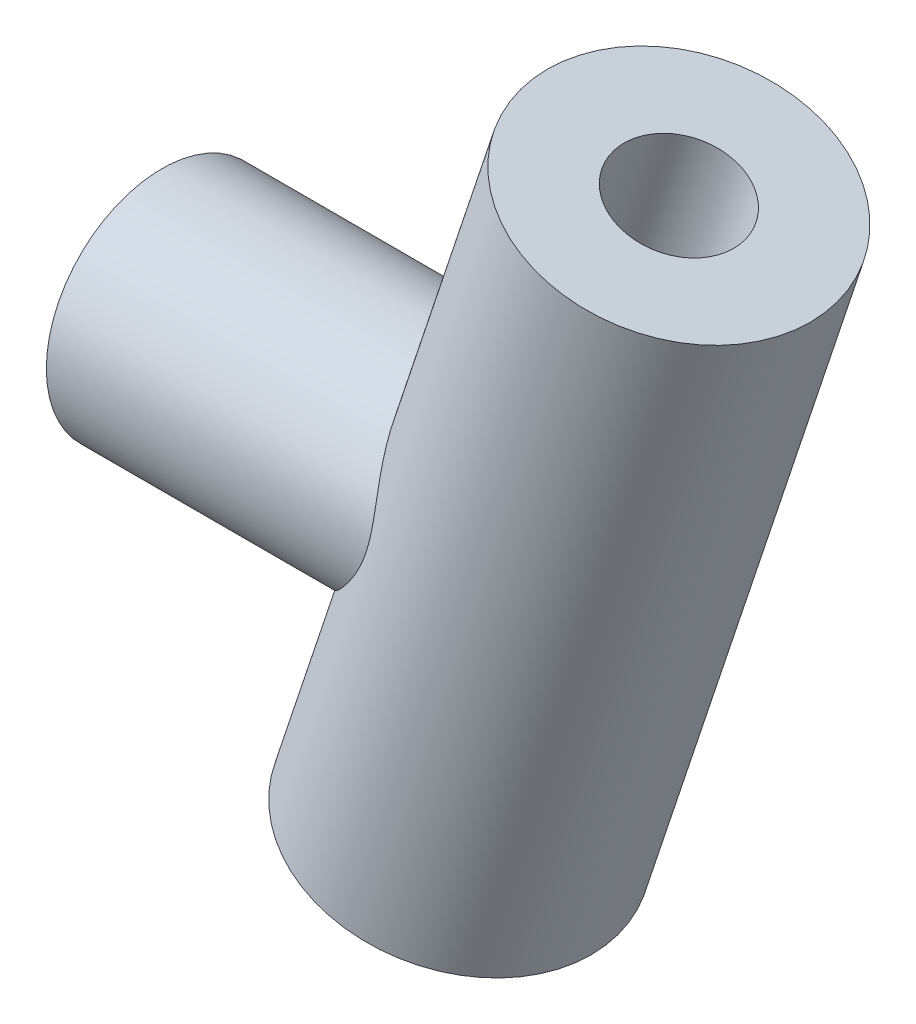
ISO-10303-21;
HEADER;
FILE_DESCRIPTION(('STEP AP214'),'2;1');
FILE_NAME('part.step','',(''),(''),'','','');
FILE_SCHEMA(('AUTOMOTIVE_DESIGN { 1 0 10303 214 1 1 1 1 }'));
ENDSEC;
DATA;
#1=APPLICATION_CONTEXT('core data for automotive mechanical design processes');
#2=APPLICATION_PROTOCOL_DEFINITION('international standard','automotive_design',2000,#1);
#3=PRODUCT_CONTEXT('',#1,'mechanical');
#4=PRODUCT('Part','Part','',(#3));
#5=PRODUCT_RELATED_PRODUCT_CATEGORY('part','',(#4));
#6=PRODUCT_DEFINITION_FORMATION('','',#4);
#7=PRODUCT_DEFINITION_CONTEXT('part definition',#1,'design');
#8=PRODUCT_DEFINITION('design','',#6,#7);
#9=PRODUCT_DEFINITION_SHAPE('','',#8);
#10=(LENGTH_UNIT() NAMED_UNIT(*) SI_UNIT(.MILLI.,.METRE.));
#11=(NAMED_UNIT(*) PLANE_ANGLE_UNIT() SI_UNIT($,.RADIAN.));
#12=(NAMED_UNIT(*) SI_UNIT($,.STERADIAN.) SOLID_ANGLE_UNIT());
#13=UNCERTAINTY_MEASURE_WITH_UNIT(LENGTH_MEASURE(1.E-05),#10,'distance_accuracy_value','');
#14=(GEOMETRIC_REPRESENTATION_CONTEXT(3) GLOBAL_UNCERTAINTY_ASSIGNED_CONTEXT((#13)) GLOBAL_UNIT_ASSIGNED_CONTEXT((#10,
#11,#12)) REPRESENTATION_CONTEXT('',''));
#15=CARTESIAN_POINT('',(0.,0.,0.));
#16=DIRECTION('',(0.,0.,1.));
#17=DIRECTION('',(1.,0.,0.));
#18=AXIS2_PLACEMENT_3D('',#15,#16,#17);
#19=CARTESIAN_POINT('',(108.368366818809,40.1471764116337,220.40323439009));
#20=DIRECTION('',(-0.316227766016478,-0.948683298050634,0.));
#21=DIRECTION('',(0.948683298050634,-0.316227766016478,0.));
#22=AXIS2_PLACEMENT_3D('',#19,#20,#21);
#23=CYLINDRICAL_SURFACE('',#22,2.50000000000002);
#24=CARTESIAN_POINT('',(102.043811498479,21.173510450621,220.40323439009));
#25=DIRECTION('',(-0.316227766016478,-0.948683298050634,0.));
#26=DIRECTION('',(0.948683298050634,-0.316227766016478,0.));
#27=AXIS2_PLACEMENT_3D('',#24,#25,#26);
#28=CIRCLE('',#27,2.50000000000002);
#29=CARTESIAN_POINT('',(104.415519743606,20.3829410355798,220.40323439009));
#30=VERTEX_POINT('',#29);
#31=EDGE_CURVE('E188',#30,#30,#28,.T.);
#32=ORIENTED_EDGE('',*,*,#31,.F.);
#33=EDGE_LOOP('',(#32));
#34=FACE_BOUND('',#33,.T.);
#35=CARTESIAN_POINT('',(92.5569785179846,-7.286988490898,220.40323439009));
#36=DIRECTION('',(-0.316227766016478,-0.948683298050634,0.));
#37=DIRECTION('',(0.948683298050634,-0.316227766016478,0.));
#38=AXIS2_PLACEMENT_3D('',#35,#36,#37);
#39=CIRCLE('',#38,2.50000000000002);
#40=CARTESIAN_POINT('',(94.9286867631113,-8.0775579059392,220.40323439009));
#41=VERTEX_POINT('',#40);
#42=EDGE_CURVE('E70',#41,#41,#39,.T.);
#43=ORIENTED_EDGE('',*,*,#42,.T.);
#44=EDGE_LOOP('',(#43));
#45=FACE_BOUND('',#44,.T.);
#46=CARTESIAN_POINT('',(96.6617424772157,5.02730338681082,220.40323439009));
#47=DIRECTION('',(-1.,0.,0.));
#48=DIRECTION('',(0.,-1.,0.));
#49=AXIS2_PLACEMENT_3D('',#46,#47,#48);
#50=ELLIPSE('',#49,7.90569415042994,2.50000000000002);
#51=CARTESIAN_POINT('',(96.6617424772157,5.76218705966372,217.914058904364));
#52=VERTEX_POINT('',#51);
#53=CARTESIAN_POINT('',(96.6617424772157,6.4419181472921,217.94358268549));
#54=VERTEX_POINT('',#53);
#55=EDGE_CURVE('E11',#52,#54,#50,.F.);
#56=ORIENTED_EDGE('',*,*,#55,.F.);
#57=CARTESIAN_POINT('',(96.9841672422155,5.99457768181144,220.40323439009));
#58=DIRECTION('',(0.58471028466392,-0.811242185175449,0.));
#59=DIRECTION('',(-0.811242185175449,-0.58471028466392,0.));
#60=AXIS2_PLACEMENT_3D('',#57,#58,#59);
#61=ELLIPSE('',#60,4.27562173194365,2.50000000000001);
#62=CARTESIAN_POINT('',(96.6617424772158,5.76218705966011,222.892409875816));
#63=VERTEX_POINT('',#62);
#64=EDGE_CURVE('E69',#52,#63,#61,.F.);
#65=ORIENTED_EDGE('',*,*,#64,.T.);
#66=CARTESIAN_POINT('',(96.6617424772158,6.44191814729567,222.86288609469));
#67=VERTEX_POINT('',#66);
#68=EDGE_CURVE('E44',#67,#63,#50,.F.);
#69=ORIENTED_EDGE('',*,*,#68,.F.);
#70=CARTESIAN_POINT('',(96.9841672422155,5.99457768181144,220.40323439009));
#71=DIRECTION('',(-0.811242185175449,-0.58471028466392,0.));
#72=DIRECTION('',(0.58471028466392,-0.811242185175449,0.));
#73=AXIS2_PLACEMENT_3D('',#70,#71,#72);
#74=ELLIPSE('',#73,3.08169378477195,2.50000000000001);
#75=EDGE_CURVE('E38',#67,#54,#74,.T.);
#76=ORIENTED_EDGE('',*,*,#75,.T.);
#77=EDGE_LOOP('',(#56,#65,#69,#76));
#78=FACE_BOUND('',#77,.T.);
#79=ADVANCED_FACE('F33',(#34,#45,#78),#23,.F.);
#80=CARTESIAN_POINT('',(102.043811498479,21.173510450621,220.40323439009));
#81=DIRECTION('',(-0.316227766016478,-0.948683298050634,0.));
#82=DIRECTION('',(0.948683298050634,-0.316227766016478,0.));
#83=AXIS2_PLACEMENT_3D('',#80,#81,#82);
#84=CYLINDRICAL_SURFACE('',#83,6.00000000000001);
#85=CARTESIAN_POINT('',(93.4881377483158,5.99457768181147,225.40323439009));
#86=CARTESIAN_POINT('',(93.5399946342217,6.15021178801324,225.403226217205));
#87=CARTESIAN_POINT('',(93.5813798218866,6.3094517385014,225.39592273332));
#88=CARTESIAN_POINT('',(93.6404073699744,6.63073387960701,225.3652204));
#89=CARTESIAN_POINT('',(93.6580566877448,6.79277523497842,225.341826270021));
#90=CARTESIAN_POINT('',(93.6710984489186,7.11372633043472,225.279110588274));
#91=CARTESIAN_POINT('',(93.6665915890211,7.27264694919356,225.239861839614));
#92=CARTESIAN_POINT('',(93.6401028962219,7.58465563049313,225.14646767995));
#93=CARTESIAN_POINT('',(93.6180907491946,7.73773309201226,225.092296534103));
#94=CARTESIAN_POINT('',(93.5672063366524,8.00695138314288,224.982233603437));
#95=CARTESIAN_POINT('',(93.5404890230361,8.12450304439958,224.928707971729));
#96=CARTESIAN_POINT('',(93.4813860333426,8.35404939998473,224.813381315847));
#97=CARTESIAN_POINT('',(93.4489972701267,8.46604102498614,224.751575789007));
#98=CARTESIAN_POINT('',(93.3804700552284,8.68430788984032,224.620059725234));
#99=CARTESIAN_POINT('',(93.3443256984145,8.79057371586189,224.550336722721));
#100=CARTESIAN_POINT('',(93.2699291741275,8.99699444050149,224.403426644381));
#101=CARTESIAN_POINT('',(93.2316773294419,9.09715027001568,224.326240710233));
#102=CARTESIAN_POINT('',(93.1529600855957,9.29467544418092,224.161753524947));
#103=CARTESIAN_POINT('',(93.1124647292586,9.39181182984803,224.074186868872));
#104=CARTESIAN_POINT('',(93.0317973832353,9.57903996151219,223.891605552065));
#105=CARTESIAN_POINT('',(92.9916255273493,9.66912891468684,223.796587968181));
#106=CARTESIAN_POINT('',(92.9126767912046,9.84178597782958,223.5995039877));
#107=CARTESIAN_POINT('',(92.8738991336388,9.92435831914359,223.497441614461));
#108=CARTESIAN_POINT('',(92.7986236985677,10.0815743599006,223.286592010638));
#109=CARTESIAN_POINT('',(92.7621258480848,10.1562183131875,223.177804995535));
#110=CARTESIAN_POINT('',(92.6883707801357,10.3048183462116,222.941613806855));
#111=CARTESIAN_POINT('',(92.6514718207106,10.3777951810879,222.813478188994));
#112=CARTESIAN_POINT('',(92.5824749065347,10.5125852837347,222.550203741524));
#113=CARTESIAN_POINT('',(92.5503773790522,10.5743975580986,222.415064290101));
#114=CARTESIAN_POINT('',(92.4918731024728,10.68605924564,222.138799538068));
#115=CARTESIAN_POINT('',(92.4654639350428,10.7359137435401,221.997676811833));
#116=CARTESIAN_POINT('',(92.4190628571841,10.8229715450181,221.710561974183));
#117=CARTESIAN_POINT('',(92.399069912189,10.8601768882321,221.564570651986));
#118=CARTESIAN_POINT('',(92.3679164923902,10.9179337604634,221.285580312055));
#119=CARTESIAN_POINT('',(92.3560190212329,10.939881044545,221.152950939072));
#120=CARTESIAN_POINT('',(92.3380150422669,10.9730368488028,220.885969566114));
#121=CARTESIAN_POINT('',(92.3319080549783,10.9842462581279,220.751617709701));
#122=CARTESIAN_POINT('',(92.3256315015416,10.995766359125,220.48236871927));
#123=CARTESIAN_POINT('',(92.3254593457347,10.9960818043695,220.347471848767));
#124=CARTESIAN_POINT('',(92.3310501350273,10.9858213564836,220.078219488395));
#125=CARTESIAN_POINT('',(92.3368128527068,10.9752458806854,219.94386397798));
#126=CARTESIAN_POINT('',(92.3534481822985,10.9446191554965,219.687395051075));
#127=CARTESIAN_POINT('',(92.3638802728977,10.9253841129757,219.565154329911));
#128=CARTESIAN_POINT('',(92.3894539011641,10.8780249558964,219.322871276463));
#129=CARTESIAN_POINT('',(92.4045969105257,10.8498980634731,219.202829643602));
#130=CARTESIAN_POINT('',(92.4392928494744,10.7850717565278,218.965787078353));
#131=CARTESIAN_POINT('',(92.4588440732261,10.7483756578138,218.848784989241));
#132=CARTESIAN_POINT('',(92.5019857731557,10.666774572769,218.618429265966));
#133=CARTESIAN_POINT('',(92.52557772659,10.621866583833,218.50507698421));
#134=CARTESIAN_POINT('',(92.6035823959805,10.4719625766131,218.163551891986));
#135=CARTESIAN_POINT('',(92.663970554337,10.3540735066996,217.942248415681));
#136=CARTESIAN_POINT('',(92.7957048090172,10.0884657465613,217.521908037273));
#137=CARTESIAN_POINT('',(92.8670587365027,9.94072571446628,217.322887225218));
#138=CARTESIAN_POINT('',(92.98222079609,9.69006441121618,217.032438168669));
#139=CARTESIAN_POINT('',(93.024265282101,9.59619367307118,216.932333393518));
#140=CARTESIAN_POINT('',(93.1087764859234,9.40065990232594,216.74026085894));
#141=CARTESIAN_POINT('',(93.1512430949016,9.29899883511581,216.648291059704));
#142=CARTESIAN_POINT('',(93.2352432818767,9.08818718285487,216.47278874183));
#143=CARTESIAN_POINT('',(93.276776430556,8.97903324160091,216.389260046085));
#144=CARTESIAN_POINT('',(93.3571747091223,8.75359965007913,216.231094522344));
#145=CARTESIAN_POINT('',(93.3960406522102,8.63732219233914,216.156454978996));
#146=CARTESIAN_POINT('',(93.4859258075341,8.34256364251297,215.984177988043));
#147=CARTESIAN_POINT('',(93.5342886664053,8.16011652086038,215.891799392993));
#148=CARTESIAN_POINT('',(93.6122303196025,7.78198749521245,215.729126513749));
#149=CARTESIAN_POINT('',(93.641854289393,7.58633868883306,215.658779325057));
#150=CARTESIAN_POINT('',(93.6686260074032,7.22623956542186,215.55445801533));
#151=CARTESIAN_POINT('',(93.6711518025921,7.06353297304686,215.515996755412));
#152=CARTESIAN_POINT('',(93.652871426068,6.73642296341325,215.455788424371));
#153=CARTESIAN_POINT('',(93.6320992575564,6.57202236512267,215.434017072438));
#154=CARTESIAN_POINT('',(93.5662660812505,6.24687264978509,215.406934556564));
#155=CARTESIAN_POINT('',(93.5212097724162,6.08612283258424,215.401620209549));
#156=CARTESIAN_POINT('',(93.4100881583332,5.77218066942791,215.405704701502));
#157=CARTESIAN_POINT('',(93.3439884400603,5.61900118087267,215.415127740492));
#158=CARTESIAN_POINT('',(93.2111134187566,5.35206292568951,215.443256238535));
#159=CARTESIAN_POINT('',(93.1471779980172,5.23659666774436,215.459699149371));
#160=CARTESIAN_POINT('',(93.0118087648243,5.01134089480788,215.499528363738));
#161=CARTESIAN_POINT('',(92.9403699263902,4.90155525926729,215.522919340681));
#162=CARTESIAN_POINT('',(92.791833396205,4.68690457540017,215.575992528545));
#163=CARTESIAN_POINT('',(92.714715869707,4.58205909662266,215.605697547759));
#164=CARTESIAN_POINT('',(92.5566494188812,4.37712945112315,215.670855120958));
#165=CARTESIAN_POINT('',(92.475699107779,4.27704703443888,215.706309766694));
#166=CARTESIAN_POINT('',(92.2508661485316,4.00919107118135,215.810679804681));
#167=CARTESIAN_POINT('',(92.1044201395336,3.84567563398287,215.885048492147));
#168=CARTESIAN_POINT('',(91.8086191566184,3.52941769570027,216.049530325673));
#169=CARTESIAN_POINT('',(91.6592620277588,3.37668359439715,216.139655561749));
#170=CARTESIAN_POINT('',(91.3614026656051,3.08131293453164,216.33576994551));
#171=CARTESIAN_POINT('',(91.2128996038588,2.93866412926377,216.441739348586));
#172=CARTESIAN_POINT('',(90.9197455883938,2.66327259306965,216.670352390667));
#173=CARTESIAN_POINT('',(90.7750919100518,2.53052272880897,216.792983839329));
#174=CARTESIAN_POINT('',(90.5439600153414,2.32187401159439,217.008407117334));
#175=CARTESIAN_POINT('',(90.4553986670382,2.24280836205613,217.095904969133));
#176=CARTESIAN_POINT('',(90.2820742396273,2.08942895341036,217.27848747381));
#177=CARTESIAN_POINT('',(90.1973117453026,2.01511592515916,217.373573288533));
#178=CARTESIAN_POINT('',(89.9505809540233,1.80037056762376,217.670434194612));
#179=CARTESIAN_POINT('',(89.7956887855756,1.66770244111382,217.884246806933));
#180=CARTESIAN_POINT('',(89.5508602775412,1.45990704081427,218.287878846334));
#181=CARTESIAN_POINT('',(89.454336032854,1.37866553902394,218.470535393593));
#182=CARTESIAN_POINT('',(89.284449460387,1.2363559403988,218.853748099768));
#183=CARTESIAN_POINT('',(89.2110568105426,1.17526142896231,219.054280379922));
#184=CARTESIAN_POINT('',(89.103258760979,1.08576255731848,219.43601753969));
#185=CARTESIAN_POINT('',(89.0644679626028,1.05366950406647,219.615103917172));
#186=CARTESIAN_POINT('',(89.0106998637483,1.00922311325651,219.97921470761));
#187=CARTESIAN_POINT('',(88.9957064581816,0.996856425684145,220.164235018142));
#188=CARTESIAN_POINT('',(88.9908791223638,0.992872553010082,220.535126049214));
#189=CARTESIAN_POINT('',(89.0010849670597,1.00128817107432,220.720997651365));
#190=CARTESIAN_POINT('',(89.0457882899918,1.03822180920517,221.0877469386));
#191=CARTESIAN_POINT('',(89.0802976475827,1.06674965997077,221.268622136534));
#192=CARTESIAN_POINT('',(89.1702865400973,1.14138525782732,221.619106227049));
#193=CARTESIAN_POINT('',(89.2255504099667,1.18731224793816,221.788810579739));
#194=CARTESIAN_POINT('',(89.3534343537352,1.29407628680287,222.116427305357));
#195=CARTESIAN_POINT('',(89.4260603433698,1.35491841772169,222.274335634947));
#196=CARTESIAN_POINT('',(89.6338856642143,1.53005839796968,222.670278051627));
#197=CARTESIAN_POINT('',(89.7801699157457,1.65427643593801,222.898169663439));
#198=CARTESIAN_POINT('',(90.0169852564744,1.85826498849377,223.215141197954));
#199=CARTESIAN_POINT('',(90.0990025478227,1.9293639817217,223.316831513276));
#200=CARTESIAN_POINT('',(90.2676857449354,2.07680575439823,223.512256338652));
#201=CARTESIAN_POINT('',(90.3543505949713,2.15314734404722,223.605992643133));
#202=CARTESIAN_POINT('',(90.5747307566984,2.34919618648921,223.83004082568));
#203=CARTESIAN_POINT('',(90.7106346962231,2.47177494612788,223.955684268026));
#204=CARTESIAN_POINT('',(90.9873976449966,2.72628865743146,224.191157303565));
#205=CARTESIAN_POINT('',(91.1282597563333,2.85822952089509,224.300976769502));
#206=CARTESIAN_POINT('',(91.4122707216118,3.1312011203936,224.505698463503));
#207=CARTESIAN_POINT('',(91.5554215126224,3.27223990039978,224.600587228391));
#208=CARTESIAN_POINT('',(91.8410075533882,3.56363500458543,224.775811568719));
#209=CARTESIAN_POINT('',(91.983443153298,3.71398616297768,224.856155117383));
#210=CARTESIAN_POINT('',(92.21193160541,3.96731828454587,224.9750877151));
#211=CARTESIAN_POINT('',(92.2992443220291,4.06710994139565,225.018089828091));
#212=CARTESIAN_POINT('',(92.471110037339,4.2713234652904,225.098171065435));
#213=CARTESIAN_POINT('',(92.5556637277974,4.37574415597361,225.135251683699));
#214=CARTESIAN_POINT('',(92.7203638972282,4.58949200587991,225.203053896272));
#215=CARTESIAN_POINT('',(92.800522889388,4.69880343133411,225.23379431661));
#216=CARTESIAN_POINT('',(92.9548084266244,4.92318305608808,225.288461180011));
#217=CARTESIAN_POINT('',(93.0289385565819,5.0382477676546,225.312391693852));
#218=CARTESIAN_POINT('',(93.1769273489551,5.28841803948344,225.354924898646));
#219=CARTESIAN_POINT('',(93.2497646493043,5.42430291450392,225.372592304952));
#220=CARTESIAN_POINT('',(93.3808852064124,5.70391671980737,225.396747031225));
#221=CARTESIAN_POINT('',(93.4391785345892,5.84764013753828,225.403242106289));
#222=CARTESIAN_POINT('',(93.4881377483158,5.99457768181147,225.40323439009));
#223=B_SPLINE_CURVE_WITH_KNOTS('',3,(#85,#86,#87,#88,#89,#90,#91,#92,#93,#94,#95,#96,#97,#98,
#99,#100,#101,#102,#103,#104,#105,#106,#107,#108,#109,#110,#111,#112,#113,#114,#115,#116,#117,
#118,#119,#120,#121,#122,#123,#124,#125,#126,#127,#128,#129,#130,#131,#132,#133,#134,#135,#136,
#137,#138,#139,#140,#141,#142,#143,#144,#145,#146,#147,#148,#149,#150,#151,#152,#153,#154,#155,
#156,#157,#158,#159,#160,#161,#162,#163,#164,#165,#166,#167,#168,#169,#170,#171,#172,#173,#174,
#175,#176,#177,#178,#179,#180,#181,#182,#183,#184,#185,#186,#187,#188,#189,#190,#191,#192,#193,
#194,#195,#196,#197,#198,#199,#200,#201,#202,#203,#204,#205,#206,#207,#208,#209,#210,#211,#212,
#213,#214,#215,#216,#217,#218,#219,#220,#221,#222),.UNSPECIFIED.,.T.,.F.,(4,2,2,2,2,2,2,2,2,2,2,
2,2,2,2,2,2,2,2,2,2,2,2,2,2,2,2,2,2,2,2,2,2,2,2,2,2,2,2,2,2,2,2,2,2,2,2,2,2,2,2,2,2,2,2,2,2,2,2,
2,2,2,2,2,2,2,2,2,4),(0.,0.49165109712229,0.98315805233687,1.47243324855553,1.96255757863624,
2.3577366079243,2.75313141740821,3.14915761639836,3.5451233268527,3.9554561054292,
4.36595067931223,4.77621272463075,5.18646163059141,5.64184719315233,6.09727325532755,
6.55250531512938,7.00766393535201,7.41199601296455,7.81629460699937,8.22041678344346,
8.62452347479793,8.99664704355804,9.36888698092494,9.74098312003127,10.1132155858442,
10.8835918499678,11.6545208540642,12.0847231294231,12.5148172258931,12.9451052429735,
13.3752614818361,14.00370487561,14.6306273936651,15.1300960679132,15.6288367189186,
16.1274808986726,16.6269447540704,17.0254023911575,17.4241286482942,17.8243204797313,
18.2246582315264,18.9189620670602,19.6138009996933,20.3077811490131,21.0012562729919,
21.4433901003237,21.885591756149,22.7676820999813,23.4314137634769,24.0942717200226,
24.6499390319937,25.205230130786,25.7613982711105,26.3178384506362,26.8686496998366,
27.4196488932257,28.3080339472381,28.7540052871491,29.199875746881,29.8649014882159,
30.5303509697176,31.196397097561,31.8620770073524,32.280074203306,32.6979657771534,
33.1145980451139,33.5309807358619,33.9954817850233,34.4596602778577),.UNSPECIFIED.);
#224=CARTESIAN_POINT('',(93.4881377483158,5.99457768181147,225.40323439009));
#225=VERTEX_POINT('',#224);
#226=EDGE_CURVE('E76',#225,#225,#223,.T.);
#227=ORIENTED_EDGE('',*,*,#226,.F.);
#228=EDGE_LOOP('',(#227));
#229=FACE_BOUND('',#228,.T.);
#230=CARTESIAN_POINT('',(102.043811498479,21.173510450621,220.40323439009));
#231=DIRECTION('',(-0.316227766016478,-0.948683298050634,0.));
#232=DIRECTION('',(0.948683298050634,-0.316227766016478,0.));
#233=AXIS2_PLACEMENT_3D('',#230,#231,#232);
#234=CIRCLE('',#233,6.00000000000001);
#235=CARTESIAN_POINT('',(107.735911286783,19.2761438545221,220.40323439009));
#236=VERTEX_POINT('',#235);
#237=EDGE_CURVE('E83',#236,#236,#234,.T.);
#238=ORIENTED_EDGE('',*,*,#237,.T.);
#239=EDGE_LOOP('',(#238));
#240=FACE_BOUND('',#239,.T.);
#241=CARTESIAN_POINT('',(92.5569785179846,-7.28698849089801,220.40323439009));
#242=DIRECTION('',(-0.316227766016478,-0.948683298050634,0.));
#243=DIRECTION('',(0.948683298050634,-0.316227766016478,0.));
#244=AXIS2_PLACEMENT_3D('',#241,#242,#243);
#245=CIRCLE('',#244,6.00000000000006);
#246=CARTESIAN_POINT('',(98.2490783062885,-9.18435508699689,220.40323439009));
#247=VERTEX_POINT('',#246);
#248=EDGE_CURVE('E186',#247,#247,#245,.T.);
#249=ORIENTED_EDGE('',*,*,#248,.F.);
#250=EDGE_LOOP('',(#249));
#251=FACE_BOUND('',#250,.T.);
#252=ADVANCED_FACE('F35',(#229,#240,#251),#84,.T.);
#253=CARTESIAN_POINT('',(102.043811498479,21.173510450621,220.40323439009));
#254=DIRECTION('',(-0.316227766016478,-0.948683298050634,0.));
#255=DIRECTION('',(0.948683298050634,-0.316227766016478,0.));
#256=AXIS2_PLACEMENT_3D('',#253,#254,#255);
#257=PLANE('',#256);
#258=ORIENTED_EDGE('',*,*,#31,.T.);
#259=EDGE_LOOP('',(#258));
#260=FACE_BOUND('',#259,.T.);
#261=ORIENTED_EDGE('',*,*,#237,.F.);
#262=EDGE_LOOP('',(#261));
#263=FACE_BOUND('',#262,.T.);
#264=ADVANCED_FACE('F95',(#260,#263),#257,.F.);
#265=CARTESIAN_POINT('',(92.5569785179846,-7.28698849089801,220.40323439009));
#266=DIRECTION('',(-0.316227766016478,-0.948683298050634,0.));
#267=DIRECTION('',(0.948683298050634,-0.316227766016478,0.));
#268=AXIS2_PLACEMENT_3D('',#265,#266,#267);
#269=PLANE('',#268);
#270=ORIENTED_EDGE('',*,*,#42,.F.);
#271=EDGE_LOOP('',(#270));
#272=FACE_BOUND('',#271,.T.);
#273=ORIENTED_EDGE('',*,*,#248,.T.);
#274=EDGE_LOOP('',(#273));
#275=FACE_BOUND('',#274,.T.);
#276=ADVANCED_FACE('F91',(#272,#275),#269,.T.);
#277=CARTESIAN_POINT('',(94.6617424772158,5.99457768181147,220.40323439009));
#278=DIRECTION('',(-1.,0.,0.));
#279=DIRECTION('',(0.,0.,1.));
#280=AXIS2_PLACEMENT_3D('',#277,#278,#279);
#281=CYLINDRICAL_SURFACE('',#280,5.00000000000002);
#282=CARTESIAN_POINT('',(79.6617424772157,5.99457768181143,220.40323439009));
#283=DIRECTION('',(1.,0.,0.));
#284=DIRECTION('',(0.,0.,-1.));
#285=AXIS2_PLACEMENT_3D('',#282,#283,#284);
#286=CIRCLE('',#285,5.00000000000002);
#287=CARTESIAN_POINT('',(79.6617424772157,5.99457768181143,215.40323439009));
#288=VERTEX_POINT('',#287);
#289=EDGE_CURVE('E72',#288,#288,#286,.F.);
#290=ORIENTED_EDGE('',*,*,#289,.F.);
#291=EDGE_LOOP('',(#290));
#292=FACE_BOUND('',#291,.T.);
#293=ORIENTED_EDGE('',*,*,#226,.T.);
#294=EDGE_LOOP('',(#293));
#295=FACE_BOUND('',#294,.T.);
#296=ADVANCED_FACE('F85',(#292,#295),#281,.T.);
#297=CARTESIAN_POINT('',(79.6617424772156,12.2568432066781,195.689189183041));
#298=DIRECTION('',(1.,0.,0.));
#299=DIRECTION('',(0.,0.,-1.));
#300=AXIS2_PLACEMENT_3D('',#297,#298,#299);
#301=PLANE('',#300);
#302=CARTESIAN_POINT('',(79.6617424772157,5.99457768181139,220.40323439009));
#303=DIRECTION('',(-1.,0.,0.));
#304=DIRECTION('',(0.,0.,1.));
#305=AXIS2_PLACEMENT_3D('',#302,#303,#304);
#306=CIRCLE('',#305,2.5);
#307=CARTESIAN_POINT('',(79.6617424772158,5.99457768181139,222.90323439009));
#308=VERTEX_POINT('',#307);
#309=EDGE_CURVE('E176',#308,#308,#306,.T.);
#310=ORIENTED_EDGE('',*,*,#309,.F.);
#311=EDGE_LOOP('',(#310));
#312=FACE_BOUND('',#311,.T.);
#313=ORIENTED_EDGE('',*,*,#289,.T.);
#314=EDGE_LOOP('',(#313));
#315=FACE_BOUND('',#314,.T.);
#316=ADVANCED_FACE('F90',(#312,#315),#301,.F.);
#317=CARTESIAN_POINT('',(96.6617424772157,5.99457768181144,220.40323439009));
#318=DIRECTION('',(-1.,0.,0.));
#319=DIRECTION('',(0.,0.,1.));
#320=AXIS2_PLACEMENT_3D('',#317,#318,#319);
#321=CYLINDRICAL_SURFACE('',#320,2.5);
#322=ORIENTED_EDGE('',*,*,#309,.T.);
#323=EDGE_LOOP('',(#322));
#324=FACE_BOUND('',#323,.T.);
#325=CARTESIAN_POINT('',(96.6617424772157,5.99457768181144,220.40323439009));
#326=DIRECTION('',(-1.,0.,0.));
#327=DIRECTION('',(0.,0.,1.));
#328=AXIS2_PLACEMENT_3D('',#325,#326,#327);
#329=CIRCLE('',#328,2.5);
#330=EDGE_CURVE('E50',#63,#67,#329,.T.);
#331=ORIENTED_EDGE('',*,*,#330,.F.);
#332=ORIENTED_EDGE('',*,*,#64,.F.);
#333=EDGE_CURVE('E63',#54,#52,#329,.T.);
#334=ORIENTED_EDGE('',*,*,#333,.F.);
#335=ORIENTED_EDGE('',*,*,#75,.F.);
#336=EDGE_LOOP('',(#331,#332,#334,#335));
#337=FACE_BOUND('',#336,.T.);
#338=ADVANCED_FACE('F68',(#324,#337),#321,.F.);
#339=CARTESIAN_POINT('',(96.6617424772157,5.99457768181144,220.40323439009));
#340=DIRECTION('',(-1.,0.,0.));
#341=DIRECTION('',(0.,0.,1.));
#342=AXIS2_PLACEMENT_3D('',#339,#340,#341);
#343=PLANE('',#342);
#344=ORIENTED_EDGE('',*,*,#55,.T.);
#345=ORIENTED_EDGE('',*,*,#333,.T.);
#346=EDGE_LOOP('',(#344,#345));
#347=FACE_BOUND('',#346,.T.);
#348=ADVANCED_FACE('F62',(#347),#343,.T.);
#349=ORIENTED_EDGE('',*,*,#68,.T.);
#350=ORIENTED_EDGE('',*,*,#330,.T.);
#351=EDGE_LOOP('',(#349,#350));
#352=FACE_BOUND('',#351,.T.);
#353=ADVANCED_FACE('F116',(#352),#343,.T.);
#354=CLOSED_SHELL('',(#79,#252,#264,#276,#296,#316,#338,#348,#353));
#355=MANIFOLD_SOLID_BREP('B2',#354);
#356=ADVANCED_BREP_SHAPE_REPRESENTATION('',(#18,#355),#14);
#357=SHAPE_DEFINITION_REPRESENTATION(#9,#356);
ENDSEC;
END-ISO-10303-21;
